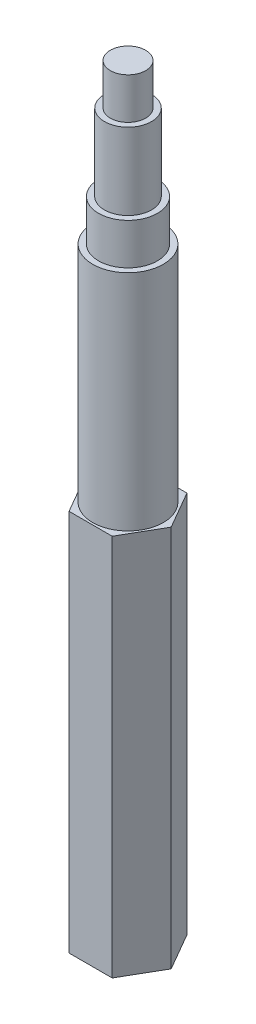
ISO-10303-21;
HEADER;
FILE_DESCRIPTION(('STEP AP214'),'2;1');
FILE_NAME('part.step','',(''),(''),'','','');
FILE_SCHEMA(('AUTOMOTIVE_DESIGN { 1 0 10303 214 1 1 1 1 }'));
ENDSEC;
DATA;
#1=APPLICATION_CONTEXT('core data for automotive mechanical design processes');
#2=APPLICATION_PROTOCOL_DEFINITION('international standard','automotive_design',2000,#1);
#3=PRODUCT_CONTEXT('',#1,'mechanical');
#4=PRODUCT('Part','Part','',(#3));
#5=PRODUCT_RELATED_PRODUCT_CATEGORY('part','',(#4));
#6=PRODUCT_DEFINITION_FORMATION('','',#4);
#7=PRODUCT_DEFINITION_CONTEXT('part definition',#1,'design');
#8=PRODUCT_DEFINITION('design','',#6,#7);
#9=PRODUCT_DEFINITION_SHAPE('','',#8);
#10=(LENGTH_UNIT() NAMED_UNIT(*) SI_UNIT(.MILLI.,.METRE.));
#11=(NAMED_UNIT(*) PLANE_ANGLE_UNIT() SI_UNIT($,.RADIAN.));
#12=(NAMED_UNIT(*) SI_UNIT($,.STERADIAN.) SOLID_ANGLE_UNIT());
#13=UNCERTAINTY_MEASURE_WITH_UNIT(LENGTH_MEASURE(1.E-05),#10,'distance_accuracy_value','');
#14=(GEOMETRIC_REPRESENTATION_CONTEXT(3) GLOBAL_UNCERTAINTY_ASSIGNED_CONTEXT((#13)) GLOBAL_UNIT_ASSIGNED_CONTEXT((#10,
#11,#12)) REPRESENTATION_CONTEXT('',''));
#15=CARTESIAN_POINT('',(0.,0.,0.));
#16=DIRECTION('',(0.,0.,1.));
#17=DIRECTION('',(1.,0.,0.));
#18=AXIS2_PLACEMENT_3D('',#15,#16,#17);
#19=CARTESIAN_POINT('',(0.,110.,0.));
#20=DIRECTION('',(0.,1.,0.));
#21=DIRECTION('',(0.,0.,1.));
#22=AXIS2_PLACEMENT_3D('',#19,#20,#21);
#23=CYLINDRICAL_SURFACE('',#22,4.);
#24=CARTESIAN_POINT('',(0.,110.,0.));
#25=DIRECTION('',(0.,1.,0.));
#26=DIRECTION('',(0.,0.,1.));
#27=AXIS2_PLACEMENT_3D('',#24,#25,#26);
#28=CIRCLE('',#27,4.);
#29=CARTESIAN_POINT('',(0.,110.,4.));
#30=VERTEX_POINT('',#29);
#31=EDGE_CURVE('E166',#30,#30,#28,.T.);
#32=ORIENTED_EDGE('',*,*,#31,.T.);
#33=EDGE_LOOP('',(#32));
#34=FACE_BOUND('',#33,.T.);
#35=CARTESIAN_POINT('',(0.,123.,0.));
#36=DIRECTION('',(0.,1.,0.));
#37=DIRECTION('',(0.,0.,1.));
#38=AXIS2_PLACEMENT_3D('',#35,#36,#37);
#39=CIRCLE('',#38,4.);
#40=CARTESIAN_POINT('',(0.,123.,4.));
#41=VERTEX_POINT('',#40);
#42=EDGE_CURVE('E169',#41,#41,#39,.T.);
#43=ORIENTED_EDGE('',*,*,#42,.F.);
#44=EDGE_LOOP('',(#43));
#45=FACE_BOUND('',#44,.T.);
#46=ADVANCED_FACE('F41',(#34,#45),#23,.T.);
#47=CARTESIAN_POINT('',(0.,103.,0.));
#48=DIRECTION('',(0.,1.,0.));
#49=DIRECTION('',(0.,0.,1.));
#50=AXIS2_PLACEMENT_3D('',#47,#48,#49);
#51=CYLINDRICAL_SURFACE('',#50,5.);
#52=CARTESIAN_POINT('',(0.,103.,0.));
#53=DIRECTION('',(0.,1.,0.));
#54=DIRECTION('',(0.,0.,1.));
#55=AXIS2_PLACEMENT_3D('',#52,#53,#54);
#56=CIRCLE('',#55,5.);
#57=CARTESIAN_POINT('',(0.,103.,5.));
#58=VERTEX_POINT('',#57);
#59=EDGE_CURVE('E160',#58,#58,#56,.T.);
#60=ORIENTED_EDGE('',*,*,#59,.T.);
#61=EDGE_LOOP('',(#60));
#62=FACE_BOUND('',#61,.T.);
#63=CARTESIAN_POINT('',(0.,110.,0.));
#64=DIRECTION('',(0.,1.,0.));
#65=DIRECTION('',(0.,0.,1.));
#66=AXIS2_PLACEMENT_3D('',#63,#64,#65);
#67=CIRCLE('',#66,5.);
#68=CARTESIAN_POINT('',(0.,110.,5.));
#69=VERTEX_POINT('',#68);
#70=EDGE_CURVE('E163',#69,#69,#67,.T.);
#71=ORIENTED_EDGE('',*,*,#70,.F.);
#72=EDGE_LOOP('',(#71));
#73=FACE_BOUND('',#72,.T.);
#74=ADVANCED_FACE('F190',(#62,#73),#51,.T.);
#75=CARTESIAN_POINT('',(0.,65.,0.));
#76=DIRECTION('',(0.,1.,0.));
#77=DIRECTION('',(0.,0.,1.));
#78=AXIS2_PLACEMENT_3D('',#75,#76,#77);
#79=CYLINDRICAL_SURFACE('',#78,6.);
#80=CARTESIAN_POINT('',(0.,65.,0.));
#81=DIRECTION('',(0.,1.,0.));
#82=DIRECTION('',(0.,0.,1.));
#83=AXIS2_PLACEMENT_3D('',#80,#81,#82);
#84=CIRCLE('',#83,6.);
#85=CARTESIAN_POINT('',(0.,65.,6.));
#86=VERTEX_POINT('',#85);
#87=EDGE_CURVE('E154',#86,#86,#84,.T.);
#88=ORIENTED_EDGE('',*,*,#87,.T.);
#89=EDGE_LOOP('',(#88));
#90=FACE_BOUND('',#89,.T.);
#91=CARTESIAN_POINT('',(0.,103.,0.));
#92=DIRECTION('',(0.,1.,0.));
#93=DIRECTION('',(0.,0.,1.));
#94=AXIS2_PLACEMENT_3D('',#91,#92,#93);
#95=CIRCLE('',#94,6.);
#96=CARTESIAN_POINT('',(0.,103.,6.));
#97=VERTEX_POINT('',#96);
#98=EDGE_CURVE('E157',#97,#97,#95,.T.);
#99=ORIENTED_EDGE('',*,*,#98,.F.);
#100=EDGE_LOOP('',(#99));
#101=FACE_BOUND('',#100,.T.);
#102=ADVANCED_FACE('F197',(#90,#101),#79,.T.);
#103=CARTESIAN_POINT('',(3.6661742093542,130.,6.34999999999996));
#104=DIRECTION('',(-0.866025403784441,0.,-0.499999999999995));
#105=DIRECTION('',(-0.499999999999995,0.,0.866025403784441));
#106=AXIS2_PLACEMENT_3D('',#103,#104,#105);
#107=PLANE('',#106);
#108=DIRECTION('',(0.499999999999995,0.,-0.866025403784441));
#109=VECTOR('',#108,1.);
#110=CARTESIAN_POINT('',(3.6661742093542,65.,6.34999999999996));
#111=LINE('',#110,#109);
#112=CARTESIAN_POINT('',(3.6661742093542,65.,6.34999999999996));
#113=VERTEX_POINT('',#112);
#114=CARTESIAN_POINT('',(7.33234841870825,65.,0.));
#115=VERTEX_POINT('',#114);
#116=EDGE_CURVE('E93',#113,#115,#111,.T.);
#117=ORIENTED_EDGE('',*,*,#116,.F.);
#118=DIRECTION('',(0.,-1.,0.));
#119=VECTOR('',#118,1.);
#120=CARTESIAN_POINT('',(3.6661742093542,130.,6.34999999999996));
#121=LINE('',#120,#119);
#122=CARTESIAN_POINT('',(3.6661742093542,0.,6.34999999999996));
#123=VERTEX_POINT('',#122);
#124=EDGE_CURVE('E63',#113,#123,#121,.T.);
#125=ORIENTED_EDGE('',*,*,#124,.T.);
#126=DIRECTION('',(0.499999999999995,0.,-0.866025403784441));
#127=VECTOR('',#126,1.);
#128=CARTESIAN_POINT('',(3.6661742093542,0.,6.34999999999996));
#129=LINE('',#128,#127);
#130=CARTESIAN_POINT('',(7.33234841870825,0.,0.));
#131=VERTEX_POINT('',#130);
#132=EDGE_CURVE('E98',#123,#131,#129,.T.);
#133=ORIENTED_EDGE('',*,*,#132,.T.);
#134=DIRECTION('',(0.,-1.,0.));
#135=VECTOR('',#134,1.);
#136=CARTESIAN_POINT('',(7.33234841870825,130.,0.));
#137=LINE('',#136,#135);
#138=EDGE_CURVE('E49',#115,#131,#137,.T.);
#139=ORIENTED_EDGE('',*,*,#138,.F.);
#140=EDGE_LOOP('',(#117,#125,#133,#139));
#141=FACE_BOUND('',#140,.T.);
#142=ADVANCED_FACE('F43',(#141),#107,.F.);
#143=CARTESIAN_POINT('',(7.33234841870825,130.,0.));
#144=DIRECTION('',(-0.866025403784438,0.,0.500000000000001));
#145=DIRECTION('',(0.500000000000001,0.,0.866025403784438));
#146=AXIS2_PLACEMENT_3D('',#143,#144,#145);
#147=PLANE('',#146);
#148=DIRECTION('',(-0.500000000000001,0.,-0.866025403784438));
#149=VECTOR('',#148,1.);
#150=CARTESIAN_POINT('',(7.33234841870825,65.,0.));
#151=LINE('',#150,#149);
#152=CARTESIAN_POINT('',(3.66617420935411,65.,-6.35000000000001));
#153=VERTEX_POINT('',#152);
#154=EDGE_CURVE('E99',#115,#153,#151,.T.);
#155=ORIENTED_EDGE('',*,*,#154,.F.);
#156=ORIENTED_EDGE('',*,*,#138,.T.);
#157=DIRECTION('',(-0.500000000000001,0.,-0.866025403784438));
#158=VECTOR('',#157,1.);
#159=CARTESIAN_POINT('',(7.33234841870825,0.,0.));
#160=LINE('',#159,#158);
#161=CARTESIAN_POINT('',(3.66617420935411,0.,-6.35000000000001));
#162=VERTEX_POINT('',#161);
#163=EDGE_CURVE('E122',#131,#162,#160,.T.);
#164=ORIENTED_EDGE('',*,*,#163,.T.);
#165=DIRECTION('',(0.,-1.,0.));
#166=VECTOR('',#165,1.);
#167=CARTESIAN_POINT('',(3.66617420935411,130.,-6.35000000000001));
#168=LINE('',#167,#166);
#169=EDGE_CURVE('E116',#153,#162,#168,.T.);
#170=ORIENTED_EDGE('',*,*,#169,.F.);
#171=EDGE_LOOP('',(#155,#156,#164,#170));
#172=FACE_BOUND('',#171,.T.);
#173=ADVANCED_FACE('F120',(#172),#147,.F.);
#174=CARTESIAN_POINT('',(3.66617420935411,130.,-6.35000000000001));
#175=DIRECTION('',(0.,0.,1.));
#176=DIRECTION('',(1.,0.,0.));
#177=AXIS2_PLACEMENT_3D('',#174,#175,#176);
#178=PLANE('',#177);
#179=DIRECTION('',(-1.,0.,0.));
#180=VECTOR('',#179,1.);
#181=CARTESIAN_POINT('',(3.66617420935411,65.,-6.35000000000001));
#182=LINE('',#181,#180);
#183=CARTESIAN_POINT('',(-3.66617420935416,65.,-6.34999999999998));
#184=VERTEX_POINT('',#183);
#185=EDGE_CURVE('E149',#153,#184,#182,.T.);
#186=ORIENTED_EDGE('',*,*,#185,.F.);
#187=ORIENTED_EDGE('',*,*,#169,.T.);
#188=DIRECTION('',(-1.,0.,0.));
#189=VECTOR('',#188,1.);
#190=CARTESIAN_POINT('',(3.66617420935411,0.,-6.35000000000001));
#191=LINE('',#190,#189);
#192=CARTESIAN_POINT('',(-3.66617420935415,0.,-6.34999999999998));
#193=VERTEX_POINT('',#192);
#194=EDGE_CURVE('E128',#162,#193,#191,.T.);
#195=ORIENTED_EDGE('',*,*,#194,.T.);
#196=DIRECTION('',(0.,-1.,0.));
#197=VECTOR('',#196,1.);
#198=CARTESIAN_POINT('',(-3.66617420935415,130.,-6.34999999999998));
#199=LINE('',#198,#197);
#200=EDGE_CURVE('E114',#184,#193,#199,.T.);
#201=ORIENTED_EDGE('',*,*,#200,.F.);
#202=EDGE_LOOP('',(#186,#187,#195,#201));
#203=FACE_BOUND('',#202,.T.);
#204=ADVANCED_FACE('F148',(#203),#178,.F.);
#205=CARTESIAN_POINT('',(-3.66617420935415,130.,-6.34999999999998));
#206=DIRECTION('',(0.866025403784442,0.,0.499999999999995));
#207=DIRECTION('',(0.499999999999995,0.,-0.866025403784442));
#208=AXIS2_PLACEMENT_3D('',#205,#206,#207);
#209=PLANE('',#208);
#210=DIRECTION('',(-0.499999999999995,0.,0.866025403784442));
#211=VECTOR('',#210,1.);
#212=CARTESIAN_POINT('',(-3.66617420935415,65.,-6.34999999999998));
#213=LINE('',#212,#211);
#214=CARTESIAN_POINT('',(-7.33234841870825,65.,0.));
#215=VERTEX_POINT('',#214);
#216=EDGE_CURVE('E145',#184,#215,#213,.T.);
#217=ORIENTED_EDGE('',*,*,#216,.F.);
#218=ORIENTED_EDGE('',*,*,#200,.T.);
#219=DIRECTION('',(-0.499999999999995,0.,0.866025403784442));
#220=VECTOR('',#219,1.);
#221=CARTESIAN_POINT('',(-3.66617420935415,0.,-6.34999999999998));
#222=LINE('',#221,#220);
#223=CARTESIAN_POINT('',(-7.33234841870824,0.,0.));
#224=VERTEX_POINT('',#223);
#225=EDGE_CURVE('E134',#193,#224,#222,.T.);
#226=ORIENTED_EDGE('',*,*,#225,.T.);
#227=DIRECTION('',(0.,-1.,0.));
#228=VECTOR('',#227,1.);
#229=CARTESIAN_POINT('',(-7.33234841870824,130.,0.));
#230=LINE('',#229,#228);
#231=EDGE_CURVE('E107',#215,#224,#230,.T.);
#232=ORIENTED_EDGE('',*,*,#231,.F.);
#233=EDGE_LOOP('',(#217,#218,#226,#232));
#234=FACE_BOUND('',#233,.T.);
#235=ADVANCED_FACE('F143',(#234),#209,.F.);
#236=CARTESIAN_POINT('',(-7.33234841870824,130.,0.));
#237=DIRECTION('',(0.866025403784435,0.,-0.500000000000007));
#238=DIRECTION('',(-0.500000000000007,0.,-0.866025403784435));
#239=AXIS2_PLACEMENT_3D('',#236,#237,#238);
#240=PLANE('',#239);
#241=DIRECTION('',(0.500000000000007,0.,0.866025403784435));
#242=VECTOR('',#241,1.);
#243=CARTESIAN_POINT('',(-7.33234841870824,65.,0.));
#244=LINE('',#243,#242);
#245=CARTESIAN_POINT('',(-3.66617420935406,65.,6.35000000000003));
#246=VERTEX_POINT('',#245);
#247=EDGE_CURVE('E55',#215,#246,#244,.T.);
#248=ORIENTED_EDGE('',*,*,#247,.F.);
#249=ORIENTED_EDGE('',*,*,#231,.T.);
#250=DIRECTION('',(0.500000000000007,0.,0.866025403784435));
#251=VECTOR('',#250,1.);
#252=CARTESIAN_POINT('',(-7.33234841870824,0.,0.));
#253=LINE('',#252,#251);
#254=CARTESIAN_POINT('',(-3.66617420935406,0.,6.35000000000003));
#255=VERTEX_POINT('',#254);
#256=EDGE_CURVE('E109',#224,#255,#253,.T.);
#257=ORIENTED_EDGE('',*,*,#256,.T.);
#258=DIRECTION('',(0.,-1.,0.));
#259=VECTOR('',#258,1.);
#260=CARTESIAN_POINT('',(-3.66617420935406,130.,6.35000000000003));
#261=LINE('',#260,#259);
#262=EDGE_CURVE('E105',#246,#255,#261,.T.);
#263=ORIENTED_EDGE('',*,*,#262,.F.);
#264=EDGE_LOOP('',(#248,#249,#257,#263));
#265=FACE_BOUND('',#264,.T.);
#266=ADVANCED_FACE('F139',(#265),#240,.F.);
#267=CARTESIAN_POINT('',(-3.66617420935406,130.,6.35000000000003));
#268=DIRECTION('',(0.,0.,-1.));
#269=DIRECTION('',(-1.,0.,0.));
#270=AXIS2_PLACEMENT_3D('',#267,#268,#269);
#271=PLANE('',#270);
#272=DIRECTION('',(1.,0.,0.));
#273=VECTOR('',#272,1.);
#274=CARTESIAN_POINT('',(-3.66617420935406,65.,6.35000000000003));
#275=LINE('',#274,#273);
#276=EDGE_CURVE('E11',#246,#113,#275,.T.);
#277=ORIENTED_EDGE('',*,*,#276,.F.);
#278=ORIENTED_EDGE('',*,*,#262,.T.);
#279=DIRECTION('',(1.,0.,0.));
#280=VECTOR('',#279,1.);
#281=CARTESIAN_POINT('',(-3.66617420935406,0.,6.35000000000003));
#282=LINE('',#281,#280);
#283=EDGE_CURVE('E103',#255,#123,#282,.T.);
#284=ORIENTED_EDGE('',*,*,#283,.T.);
#285=ORIENTED_EDGE('',*,*,#124,.F.);
#286=EDGE_LOOP('',(#277,#278,#284,#285));
#287=FACE_BOUND('',#286,.T.);
#288=ADVANCED_FACE('F101',(#287),#271,.F.);
#289=CARTESIAN_POINT('',(0.,0.,0.));
#290=DIRECTION('',(0.,1.,0.));
#291=DIRECTION('',(0.,0.,1.));
#292=AXIS2_PLACEMENT_3D('',#289,#290,#291);
#293=PLANE('',#292);
#294=ORIENTED_EDGE('',*,*,#132,.F.);
#295=ORIENTED_EDGE('',*,*,#283,.F.);
#296=ORIENTED_EDGE('',*,*,#256,.F.);
#297=ORIENTED_EDGE('',*,*,#225,.F.);
#298=ORIENTED_EDGE('',*,*,#194,.F.);
#299=ORIENTED_EDGE('',*,*,#163,.F.);
#300=EDGE_LOOP('',(#294,#295,#296,#297,#298,#299));
#301=FACE_BOUND('',#300,.T.);
#302=ADVANCED_FACE('F125',(#301),#293,.F.);
#303=CARTESIAN_POINT('',(0.,65.,0.));
#304=DIRECTION('',(0.,1.,0.));
#305=DIRECTION('',(0.,0.,1.));
#306=AXIS2_PLACEMENT_3D('',#303,#304,#305);
#307=PLANE('',#306);
#308=ORIENTED_EDGE('',*,*,#87,.F.);
#309=EDGE_LOOP('',(#308));
#310=FACE_BOUND('',#309,.T.);
#311=ORIENTED_EDGE('',*,*,#116,.T.);
#312=ORIENTED_EDGE('',*,*,#154,.T.);
#313=ORIENTED_EDGE('',*,*,#185,.T.);
#314=ORIENTED_EDGE('',*,*,#216,.T.);
#315=ORIENTED_EDGE('',*,*,#247,.T.);
#316=ORIENTED_EDGE('',*,*,#276,.T.);
#317=EDGE_LOOP('',(#311,#312,#313,#314,#315,#316));
#318=FACE_BOUND('',#317,.T.);
#319=ADVANCED_FACE('F92',(#310,#318),#307,.T.);
#320=CARTESIAN_POINT('',(0.,103.,0.));
#321=DIRECTION('',(0.,1.,0.));
#322=DIRECTION('',(0.,0.,1.));
#323=AXIS2_PLACEMENT_3D('',#320,#321,#322);
#324=PLANE('',#323);
#325=ORIENTED_EDGE('',*,*,#59,.F.);
#326=EDGE_LOOP('',(#325));
#327=FACE_BOUND('',#326,.T.);
#328=ORIENTED_EDGE('',*,*,#98,.T.);
#329=EDGE_LOOP('',(#328));
#330=FACE_BOUND('',#329,.T.);
#331=ADVANCED_FACE('F202',(#327,#330),#324,.T.);
#332=CARTESIAN_POINT('',(0.,110.,0.));
#333=DIRECTION('',(0.,1.,0.));
#334=DIRECTION('',(0.,0.,1.));
#335=AXIS2_PLACEMENT_3D('',#332,#333,#334);
#336=PLANE('',#335);
#337=ORIENTED_EDGE('',*,*,#31,.F.);
#338=EDGE_LOOP('',(#337));
#339=FACE_BOUND('',#338,.T.);
#340=ORIENTED_EDGE('',*,*,#70,.T.);
#341=EDGE_LOOP('',(#340));
#342=FACE_BOUND('',#341,.T.);
#343=ADVANCED_FACE('F185',(#339,#342),#336,.T.);
#344=CARTESIAN_POINT('',(0.,123.,0.));
#345=DIRECTION('',(0.,1.,0.));
#346=DIRECTION('',(0.,0.,1.));
#347=AXIS2_PLACEMENT_3D('',#344,#345,#346);
#348=PLANE('',#347);
#349=CARTESIAN_POINT('',(0.,123.,0.));
#350=DIRECTION('',(0.,1.,0.));
#351=DIRECTION('',(0.,0.,1.));
#352=AXIS2_PLACEMENT_3D('',#349,#350,#351);
#353=CIRCLE('',#352,3.);
#354=CARTESIAN_POINT('',(0.,123.,3.));
#355=VERTEX_POINT('',#354);
#356=EDGE_CURVE('E172',#355,#355,#353,.T.);
#357=ORIENTED_EDGE('',*,*,#356,.F.);
#358=EDGE_LOOP('',(#357));
#359=FACE_BOUND('',#358,.T.);
#360=ORIENTED_EDGE('',*,*,#42,.T.);
#361=EDGE_LOOP('',(#360));
#362=FACE_BOUND('',#361,.T.);
#363=ADVANCED_FACE('F182',(#359,#362),#348,.T.);
#364=CARTESIAN_POINT('',(0.,123.,0.));
#365=DIRECTION('',(0.,1.,0.));
#366=DIRECTION('',(0.,0.,1.));
#367=AXIS2_PLACEMENT_3D('',#364,#365,#366);
#368=CYLINDRICAL_SURFACE('',#367,3.);
#369=ORIENTED_EDGE('',*,*,#356,.T.);
#370=EDGE_LOOP('',(#369));
#371=FACE_BOUND('',#370,.T.);
#372=CARTESIAN_POINT('',(0.,130.,0.));
#373=DIRECTION('',(0.,1.,0.));
#374=DIRECTION('',(0.,0.,1.));
#375=AXIS2_PLACEMENT_3D('',#372,#373,#374);
#376=CIRCLE('',#375,3.);
#377=CARTESIAN_POINT('',(0.,130.,3.));
#378=VERTEX_POINT('',#377);
#379=EDGE_CURVE('E173',#378,#378,#376,.T.);
#380=ORIENTED_EDGE('',*,*,#379,.F.);
#381=EDGE_LOOP('',(#380));
#382=FACE_BOUND('',#381,.T.);
#383=ADVANCED_FACE('F179',(#371,#382),#368,.T.);
#384=CARTESIAN_POINT('',(0.,130.,0.));
#385=DIRECTION('',(0.,1.,0.));
#386=DIRECTION('',(0.,0.,1.));
#387=AXIS2_PLACEMENT_3D('',#384,#385,#386);
#388=PLANE('',#387);
#389=ORIENTED_EDGE('',*,*,#379,.T.);
#390=EDGE_LOOP('',(#389));
#391=FACE_BOUND('',#390,.T.);
#392=ADVANCED_FACE('F214',(#391),#388,.T.);
#393=CLOSED_SHELL('',(#46,#74,#102,#142,#173,#204,#235,#266,#288,#302,#319,#331,#343,#363,#383,#392));
#394=MANIFOLD_SOLID_BREP('B2',#393);
#395=ADVANCED_BREP_SHAPE_REPRESENTATION('',(#18,#394),#14);
#396=SHAPE_DEFINITION_REPRESENTATION(#9,#395);
ENDSEC;
END-ISO-10303-21;
